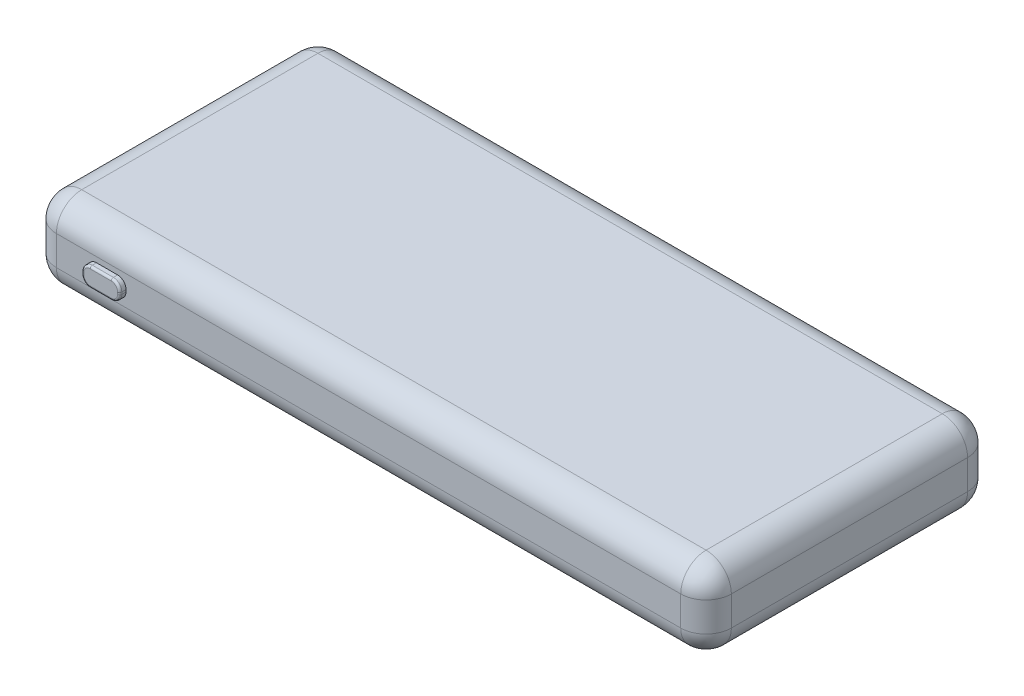
ISO-10303-21;
HEADER;
FILE_DESCRIPTION(('STEP AP214'),'2;1');
FILE_NAME('part.step','',(''),(''),'','','');
FILE_SCHEMA(('AUTOMOTIVE_DESIGN { 1 0 10303 214 1 1 1 1 }'));
ENDSEC;
DATA;
#1=APPLICATION_CONTEXT('core data for automotive mechanical design processes');
#2=APPLICATION_PROTOCOL_DEFINITION('international standard','automotive_design',2000,#1);
#3=PRODUCT_CONTEXT('',#1,'mechanical');
#4=PRODUCT('Part','Part','',(#3));
#5=PRODUCT_RELATED_PRODUCT_CATEGORY('part','',(#4));
#6=PRODUCT_DEFINITION_FORMATION('','',#4);
#7=PRODUCT_DEFINITION_CONTEXT('part definition',#1,'design');
#8=PRODUCT_DEFINITION('design','',#6,#7);
#9=PRODUCT_DEFINITION_SHAPE('','',#8);
#10=(LENGTH_UNIT() NAMED_UNIT(*) SI_UNIT(.MILLI.,.METRE.));
#11=(NAMED_UNIT(*) PLANE_ANGLE_UNIT() SI_UNIT($,.RADIAN.));
#12=(NAMED_UNIT(*) SI_UNIT($,.STERADIAN.) SOLID_ANGLE_UNIT());
#13=UNCERTAINTY_MEASURE_WITH_UNIT(LENGTH_MEASURE(1.E-05),#10,'distance_accuracy_value','');
#14=(GEOMETRIC_REPRESENTATION_CONTEXT(3) GLOBAL_UNCERTAINTY_ASSIGNED_CONTEXT((#13)) GLOBAL_UNIT_ASSIGNED_CONTEXT((#10,
#11,#12)) REPRESENTATION_CONTEXT('',''));
#15=CARTESIAN_POINT('',(0.,0.,0.));
#16=DIRECTION('',(0.,0.,1.));
#17=DIRECTION('',(1.,0.,0.));
#18=AXIS2_PLACEMENT_3D('',#15,#16,#17);
#19=CARTESIAN_POINT('',(-80.,19.,34.));
#20=DIRECTION('',(0.,0.,-1.));
#21=DIRECTION('',(-1.,0.,0.));
#22=AXIS2_PLACEMENT_3D('',#19,#20,#21);
#23=PLANE('',#22);
#24=DIRECTION('',(1.,0.,0.));
#25=VECTOR('',#24,1.);
#26=CARTESIAN_POINT('',(-80.,13.,34.));
#27=LINE('',#26,#25);
#28=CARTESIAN_POINT('',(74.,13.,34.));
#29=VERTEX_POINT('',#28);
#30=CARTESIAN_POINT('',(-74.,13.,34.));
#31=VERTEX_POINT('',#30);
#32=EDGE_CURVE('E208',#29,#31,#27,.F.);
#33=ORIENTED_EDGE('',*,*,#32,.T.);
#34=DIRECTION('',(0.,-1.,0.));
#35=VECTOR('',#34,1.);
#36=CARTESIAN_POINT('',(-74.,19.,34.));
#37=LINE('',#36,#35);
#38=CARTESIAN_POINT('',(-74.,6.,34.));
#39=VERTEX_POINT('',#38);
#40=EDGE_CURVE('E247',#31,#39,#37,.T.);
#41=ORIENTED_EDGE('',*,*,#40,.T.);
#42=DIRECTION('',(1.,0.,0.));
#43=VECTOR('',#42,1.);
#44=CARTESIAN_POINT('',(80.,6.,34.));
#45=LINE('',#44,#43);
#46=CARTESIAN_POINT('',(74.,6.,34.));
#47=VERTEX_POINT('',#46);
#48=EDGE_CURVE('E240',#39,#47,#45,.T.);
#49=ORIENTED_EDGE('',*,*,#48,.T.);
#50=DIRECTION('',(0.,-1.,0.));
#51=VECTOR('',#50,1.);
#52=CARTESIAN_POINT('',(74.,19.,34.));
#53=LINE('',#52,#51);
#54=EDGE_CURVE('E238',#47,#29,#53,.F.);
#55=ORIENTED_EDGE('',*,*,#54,.T.);
#56=EDGE_LOOP('',(#33,#41,#49,#55));
#57=FACE_BOUND('',#56,.T.);
#58=DIRECTION('',(0.,1.,0.));
#59=VECTOR('',#58,1.);
#60=CARTESIAN_POINT('',(-57.5,7.25,34.));
#61=LINE('',#60,#59);
#62=CARTESIAN_POINT('',(-57.5,9.25,34.));
#63=VERTEX_POINT('',#62);
#64=CARTESIAN_POINT('',(-57.5,9.75,34.));
#65=VERTEX_POINT('',#64);
#66=EDGE_CURVE('E422',#63,#65,#61,.T.);
#67=ORIENTED_EDGE('',*,*,#66,.F.);
#68=CARTESIAN_POINT('',(-59.5,9.25,34.));
#69=DIRECTION('',(0.,0.,-1.));
#70=DIRECTION('',(-1.,0.,0.));
#71=AXIS2_PLACEMENT_3D('',#68,#69,#70);
#72=CIRCLE('',#71,2.);
#73=CARTESIAN_POINT('',(-59.5,7.25,34.));
#74=VERTEX_POINT('',#73);
#75=EDGE_CURVE('E387',#63,#74,#72,.T.);
#76=ORIENTED_EDGE('',*,*,#75,.T.);
#77=DIRECTION('',(1.,0.,0.));
#78=VECTOR('',#77,1.);
#79=CARTESIAN_POINT('',(-66.5,7.25,34.));
#80=LINE('',#79,#78);
#81=CARTESIAN_POINT('',(-64.5,7.25,34.));
#82=VERTEX_POINT('',#81);
#83=EDGE_CURVE('E211',#82,#74,#80,.T.);
#84=ORIENTED_EDGE('',*,*,#83,.F.);
#85=CARTESIAN_POINT('',(-64.5,9.25,34.));
#86=DIRECTION('',(0.,0.,-1.));
#87=DIRECTION('',(-1.,0.,0.));
#88=AXIS2_PLACEMENT_3D('',#85,#86,#87);
#89=CIRCLE('',#88,2.);
#90=CARTESIAN_POINT('',(-66.5,9.25,34.));
#91=VERTEX_POINT('',#90);
#92=EDGE_CURVE('E48',#82,#91,#89,.T.);
#93=ORIENTED_EDGE('',*,*,#92,.T.);
#94=DIRECTION('',(0.,-1.,0.));
#95=VECTOR('',#94,1.);
#96=CARTESIAN_POINT('',(-66.5,7.25,34.));
#97=LINE('',#96,#95);
#98=CARTESIAN_POINT('',(-66.5,9.75,34.));
#99=VERTEX_POINT('',#98);
#100=EDGE_CURVE('E429',#99,#91,#97,.T.);
#101=ORIENTED_EDGE('',*,*,#100,.F.);
#102=CARTESIAN_POINT('',(-64.5,9.75,34.));
#103=DIRECTION('',(0.,0.,-1.));
#104=DIRECTION('',(-1.,0.,0.));
#105=AXIS2_PLACEMENT_3D('',#102,#103,#104);
#106=CIRCLE('',#105,2.);
#107=CARTESIAN_POINT('',(-64.5,11.75,34.));
#108=VERTEX_POINT('',#107);
#109=EDGE_CURVE('E12',#99,#108,#106,.T.);
#110=ORIENTED_EDGE('',*,*,#109,.T.);
#111=DIRECTION('',(-1.,0.,0.));
#112=VECTOR('',#111,1.);
#113=CARTESIAN_POINT('',(-66.5,11.75,34.));
#114=LINE('',#113,#112);
#115=CARTESIAN_POINT('',(-59.5,11.75,34.));
#116=VERTEX_POINT('',#115);
#117=EDGE_CURVE('E425',#116,#108,#114,.T.);
#118=ORIENTED_EDGE('',*,*,#117,.F.);
#119=CARTESIAN_POINT('',(-59.5,9.75,34.));
#120=DIRECTION('',(0.,0.,-1.));
#121=DIRECTION('',(-1.,0.,0.));
#122=AXIS2_PLACEMENT_3D('',#119,#120,#121);
#123=CIRCLE('',#122,2.);
#124=EDGE_CURVE('E385',#116,#65,#123,.T.);
#125=ORIENTED_EDGE('',*,*,#124,.T.);
#126=EDGE_LOOP('',(#67,#76,#84,#93,#101,#110,#118,#125));
#127=FACE_BOUND('',#126,.T.);
#128=ADVANCED_FACE('F39',(#57,#127),#23,.F.);
#129=CARTESIAN_POINT('',(80.,19.,34.));
#130=DIRECTION('',(-1.,0.,0.));
#131=DIRECTION('',(0.,0.,1.));
#132=AXIS2_PLACEMENT_3D('',#129,#130,#131);
#133=PLANE('',#132);
#134=DIRECTION('',(0.,0.,-1.));
#135=VECTOR('',#134,1.);
#136=CARTESIAN_POINT('',(80.,6.,-34.));
#137=LINE('',#136,#135);
#138=CARTESIAN_POINT('',(80.,6.,28.));
#139=VERTEX_POINT('',#138);
#140=CARTESIAN_POINT('',(80.,6.,-28.));
#141=VERTEX_POINT('',#140);
#142=EDGE_CURVE('E269',#139,#141,#137,.T.);
#143=ORIENTED_EDGE('',*,*,#142,.T.);
#144=DIRECTION('',(0.,-1.,0.));
#145=VECTOR('',#144,1.);
#146=CARTESIAN_POINT('',(80.,19.,-28.));
#147=LINE('',#146,#145);
#148=CARTESIAN_POINT('',(80.,13.,-28.));
#149=VERTEX_POINT('',#148);
#150=EDGE_CURVE('E274',#141,#149,#147,.F.);
#151=ORIENTED_EDGE('',*,*,#150,.T.);
#152=DIRECTION('',(0.,0.,-1.));
#153=VECTOR('',#152,1.);
#154=CARTESIAN_POINT('',(80.,13.,34.));
#155=LINE('',#154,#153);
#156=CARTESIAN_POINT('',(80.,13.,28.));
#157=VERTEX_POINT('',#156);
#158=EDGE_CURVE('E271',#149,#157,#155,.F.);
#159=ORIENTED_EDGE('',*,*,#158,.T.);
#160=DIRECTION('',(0.,-1.,0.));
#161=VECTOR('',#160,1.);
#162=CARTESIAN_POINT('',(80.,19.,28.));
#163=LINE('',#162,#161);
#164=EDGE_CURVE('E267',#157,#139,#163,.T.);
#165=ORIENTED_EDGE('',*,*,#164,.T.);
#166=EDGE_LOOP('',(#143,#151,#159,#165));
#167=FACE_BOUND('',#166,.T.);
#168=ADVANCED_FACE('F467',(#167),#133,.F.);
#169=CARTESIAN_POINT('',(-80.,19.,-34.));
#170=DIRECTION('',(0.,0.,1.));
#171=DIRECTION('',(1.,0.,0.));
#172=AXIS2_PLACEMENT_3D('',#169,#170,#171);
#173=PLANE('',#172);
#174=DIRECTION('',(-1.,0.,0.));
#175=VECTOR('',#174,1.);
#176=CARTESIAN_POINT('',(-80.,6.,-34.));
#177=LINE('',#176,#175);
#178=CARTESIAN_POINT('',(74.,6.,-34.));
#179=VERTEX_POINT('',#178);
#180=CARTESIAN_POINT('',(-74.,6.,-34.));
#181=VERTEX_POINT('',#180);
#182=EDGE_CURVE('E260',#179,#181,#177,.T.);
#183=ORIENTED_EDGE('',*,*,#182,.T.);
#184=DIRECTION('',(0.,-1.,0.));
#185=VECTOR('',#184,1.);
#186=CARTESIAN_POINT('',(-74.,19.,-34.));
#187=LINE('',#186,#185);
#188=CARTESIAN_POINT('',(-74.,13.,-34.));
#189=VERTEX_POINT('',#188);
#190=EDGE_CURVE('E265',#181,#189,#187,.F.);
#191=ORIENTED_EDGE('',*,*,#190,.T.);
#192=DIRECTION('',(-1.,0.,0.));
#193=VECTOR('',#192,1.);
#194=CARTESIAN_POINT('',(-80.,13.,-34.));
#195=LINE('',#194,#193);
#196=CARTESIAN_POINT('',(74.,13.,-34.));
#197=VERTEX_POINT('',#196);
#198=EDGE_CURVE('E262',#189,#197,#195,.F.);
#199=ORIENTED_EDGE('',*,*,#198,.T.);
#200=DIRECTION('',(0.,-1.,0.));
#201=VECTOR('',#200,1.);
#202=CARTESIAN_POINT('',(74.,19.,-34.));
#203=LINE('',#202,#201);
#204=EDGE_CURVE('E258',#197,#179,#203,.T.);
#205=ORIENTED_EDGE('',*,*,#204,.T.);
#206=EDGE_LOOP('',(#183,#191,#199,#205));
#207=FACE_BOUND('',#206,.T.);
#208=ADVANCED_FACE('F491',(#207),#173,.F.);
#209=CARTESIAN_POINT('',(-80.,19.,34.));
#210=DIRECTION('',(1.,0.,0.));
#211=DIRECTION('',(0.,0.,-1.));
#212=AXIS2_PLACEMENT_3D('',#209,#210,#211);
#213=PLANE('',#212);
#214=DIRECTION('',(0.,0.,1.));
#215=VECTOR('',#214,1.);
#216=CARTESIAN_POINT('',(-80.,6.,34.));
#217=LINE('',#216,#215);
#218=CARTESIAN_POINT('',(-80.,6.,-28.));
#219=VERTEX_POINT('',#218);
#220=CARTESIAN_POINT('',(-80.,6.,28.));
#221=VERTEX_POINT('',#220);
#222=EDGE_CURVE('E251',#219,#221,#217,.T.);
#223=ORIENTED_EDGE('',*,*,#222,.T.);
#224=DIRECTION('',(0.,-1.,0.));
#225=VECTOR('',#224,1.);
#226=CARTESIAN_POINT('',(-80.,19.,28.));
#227=LINE('',#226,#225);
#228=CARTESIAN_POINT('',(-80.,13.,28.));
#229=VERTEX_POINT('',#228);
#230=EDGE_CURVE('E256',#221,#229,#227,.F.);
#231=ORIENTED_EDGE('',*,*,#230,.T.);
#232=DIRECTION('',(0.,0.,1.));
#233=VECTOR('',#232,1.);
#234=CARTESIAN_POINT('',(-80.,13.,34.));
#235=LINE('',#234,#233);
#236=CARTESIAN_POINT('',(-80.,13.,-28.));
#237=VERTEX_POINT('',#236);
#238=EDGE_CURVE('E253',#229,#237,#235,.F.);
#239=ORIENTED_EDGE('',*,*,#238,.T.);
#240=DIRECTION('',(0.,-1.,0.));
#241=VECTOR('',#240,1.);
#242=CARTESIAN_POINT('',(-80.,19.,-28.));
#243=LINE('',#242,#241);
#244=EDGE_CURVE('E249',#237,#219,#243,.T.);
#245=ORIENTED_EDGE('',*,*,#244,.T.);
#246=EDGE_LOOP('',(#223,#231,#239,#245));
#247=FACE_BOUND('',#246,.T.);
#248=ADVANCED_FACE('F497',(#247),#213,.F.);
#249=CARTESIAN_POINT('',(0.,19.,0.));
#250=DIRECTION('',(0.,-1.,0.));
#251=DIRECTION('',(0.,0.,-1.));
#252=AXIS2_PLACEMENT_3D('',#249,#250,#251);
#253=PLANE('',#252);
#254=DIRECTION('',(0.,0.,1.));
#255=VECTOR('',#254,1.);
#256=CARTESIAN_POINT('',(-74.,19.,0.));
#257=LINE('',#256,#255);
#258=CARTESIAN_POINT('',(-74.,19.,-28.));
#259=VERTEX_POINT('',#258);
#260=CARTESIAN_POINT('',(-74.,19.,28.));
#261=VERTEX_POINT('',#260);
#262=EDGE_CURVE('E236',#259,#261,#257,.T.);
#263=ORIENTED_EDGE('',*,*,#262,.T.);
#264=DIRECTION('',(1.,0.,0.));
#265=VECTOR('',#264,1.);
#266=CARTESIAN_POINT('',(0.,19.,28.));
#267=LINE('',#266,#265);
#268=CARTESIAN_POINT('',(74.,19.,28.));
#269=VERTEX_POINT('',#268);
#270=EDGE_CURVE('E206',#261,#269,#267,.T.);
#271=ORIENTED_EDGE('',*,*,#270,.T.);
#272=DIRECTION('',(0.,0.,-1.));
#273=VECTOR('',#272,1.);
#274=CARTESIAN_POINT('',(74.,19.,0.));
#275=LINE('',#274,#273);
#276=CARTESIAN_POINT('',(74.,19.,-28.));
#277=VERTEX_POINT('',#276);
#278=EDGE_CURVE('E225',#269,#277,#275,.T.);
#279=ORIENTED_EDGE('',*,*,#278,.T.);
#280=DIRECTION('',(-1.,0.,0.));
#281=VECTOR('',#280,1.);
#282=CARTESIAN_POINT('',(0.,19.,-28.));
#283=LINE('',#282,#281);
#284=EDGE_CURVE('E231',#277,#259,#283,.T.);
#285=ORIENTED_EDGE('',*,*,#284,.T.);
#286=EDGE_LOOP('',(#263,#271,#279,#285));
#287=FACE_BOUND('',#286,.T.);
#288=ADVANCED_FACE('F234',(#287),#253,.F.);
#289=CARTESIAN_POINT('',(0.,0.,0.));
#290=DIRECTION('',(0.,-1.,0.));
#291=DIRECTION('',(0.,0.,-1.));
#292=AXIS2_PLACEMENT_3D('',#289,#290,#291);
#293=PLANE('',#292);
#294=DIRECTION('',(0.,0.,1.));
#295=VECTOR('',#294,1.);
#296=CARTESIAN_POINT('',(-74.,0.,-34.));
#297=LINE('',#296,#295);
#298=CARTESIAN_POINT('',(-74.,0.,28.));
#299=VERTEX_POINT('',#298);
#300=CARTESIAN_POINT('',(-74.,0.,-28.));
#301=VERTEX_POINT('',#300);
#302=EDGE_CURVE('E280',#299,#301,#297,.F.);
#303=ORIENTED_EDGE('',*,*,#302,.T.);
#304=DIRECTION('',(-1.,0.,0.));
#305=VECTOR('',#304,1.);
#306=CARTESIAN_POINT('',(80.,0.,-28.));
#307=LINE('',#306,#305);
#308=CARTESIAN_POINT('',(74.,0.,-28.));
#309=VERTEX_POINT('',#308);
#310=EDGE_CURVE('E282',#301,#309,#307,.F.);
#311=ORIENTED_EDGE('',*,*,#310,.T.);
#312=DIRECTION('',(0.,0.,-1.));
#313=VECTOR('',#312,1.);
#314=CARTESIAN_POINT('',(74.,0.,34.));
#315=LINE('',#314,#313);
#316=CARTESIAN_POINT('',(74.,0.,28.));
#317=VERTEX_POINT('',#316);
#318=EDGE_CURVE('E276',#309,#317,#315,.F.);
#319=ORIENTED_EDGE('',*,*,#318,.T.);
#320=DIRECTION('',(1.,0.,0.));
#321=VECTOR('',#320,1.);
#322=CARTESIAN_POINT('',(-80.,0.,28.));
#323=LINE('',#322,#321);
#324=EDGE_CURVE('E278',#317,#299,#323,.F.);
#325=ORIENTED_EDGE('',*,*,#324,.T.);
#326=EDGE_LOOP('',(#303,#311,#319,#325));
#327=FACE_BOUND('',#326,.T.);
#328=ADVANCED_FACE('F495',(#327),#293,.T.);
#329=CARTESIAN_POINT('',(-80.,6.,-28.));
#330=DIRECTION('',(1.,0.,0.));
#331=DIRECTION('',(0.,0.,-1.));
#332=AXIS2_PLACEMENT_3D('',#329,#330,#331);
#333=CYLINDRICAL_SURFACE('',#332,6.);
#334=CARTESIAN_POINT('',(-74.,6.,-28.));
#335=DIRECTION('',(-1.,0.,0.));
#336=DIRECTION('',(0.,0.,1.));
#337=AXIS2_PLACEMENT_3D('',#334,#335,#336);
#338=CIRCLE('',#337,6.);
#339=EDGE_CURVE('E232',#181,#301,#338,.T.);
#340=ORIENTED_EDGE('',*,*,#339,.F.);
#341=ORIENTED_EDGE('',*,*,#182,.F.);
#342=CARTESIAN_POINT('',(74.,6.,-28.));
#343=DIRECTION('',(1.,0.,0.));
#344=DIRECTION('',(0.,0.,-1.));
#345=AXIS2_PLACEMENT_3D('',#342,#343,#344);
#346=CIRCLE('',#345,6.);
#347=EDGE_CURVE('E337',#309,#179,#346,.T.);
#348=ORIENTED_EDGE('',*,*,#347,.F.);
#349=ORIENTED_EDGE('',*,*,#310,.F.);
#350=EDGE_LOOP('',(#340,#341,#348,#349));
#351=FACE_BOUND('',#350,.T.);
#352=ADVANCED_FACE('F889',(#351),#333,.T.);
#353=CARTESIAN_POINT('',(-74.,6.,-28.));
#354=DIRECTION('',(0.,-1.,0.));
#355=DIRECTION('',(0.,0.,-1.));
#356=AXIS2_PLACEMENT_3D('',#353,#354,#355);
#357=SPHERICAL_SURFACE('',#356,6.);
#358=CARTESIAN_POINT('',(-74.,6.,-28.));
#359=DIRECTION('',(0.,-1.,0.));
#360=DIRECTION('',(0.,0.,-1.));
#361=AXIS2_PLACEMENT_3D('',#358,#359,#360);
#362=CIRCLE('',#361,6.);
#363=EDGE_CURVE('E331',#181,#219,#362,.F.);
#364=ORIENTED_EDGE('',*,*,#363,.F.);
#365=ORIENTED_EDGE('',*,*,#339,.T.);
#366=CARTESIAN_POINT('',(-74.,6.,-28.));
#367=DIRECTION('',(0.,0.,-1.));
#368=DIRECTION('',(-1.,0.,0.));
#369=AXIS2_PLACEMENT_3D('',#366,#367,#368);
#370=CIRCLE('',#369,6.);
#371=EDGE_CURVE('E334',#219,#301,#370,.F.);
#372=ORIENTED_EDGE('',*,*,#371,.F.);
#373=EDGE_LOOP('',(#364,#365,#372));
#374=FACE_BOUND('',#373,.T.);
#375=ADVANCED_FACE('F878',(#374),#357,.T.);
#376=CARTESIAN_POINT('',(74.,6.,-28.));
#377=DIRECTION('',(0.,0.,-1.));
#378=DIRECTION('',(-1.,0.,0.));
#379=AXIS2_PLACEMENT_3D('',#376,#377,#378);
#380=SPHERICAL_SURFACE('',#379,6.);
#381=CARTESIAN_POINT('',(74.,6.,-28.));
#382=DIRECTION('',(0.,0.,-1.));
#383=DIRECTION('',(-1.,0.,0.));
#384=AXIS2_PLACEMENT_3D('',#381,#382,#383);
#385=CIRCLE('',#384,6.);
#386=EDGE_CURVE('E325',#309,#141,#385,.F.);
#387=ORIENTED_EDGE('',*,*,#386,.F.);
#388=ORIENTED_EDGE('',*,*,#347,.T.);
#389=CARTESIAN_POINT('',(74.,6.,-28.));
#390=DIRECTION('',(0.,-1.,0.));
#391=DIRECTION('',(0.,0.,-1.));
#392=AXIS2_PLACEMENT_3D('',#389,#390,#391);
#393=CIRCLE('',#392,6.);
#394=EDGE_CURVE('E328',#141,#179,#393,.F.);
#395=ORIENTED_EDGE('',*,*,#394,.F.);
#396=EDGE_LOOP('',(#387,#388,#395));
#397=FACE_BOUND('',#396,.T.);
#398=ADVANCED_FACE('F867',(#397),#380,.T.);
#399=CARTESIAN_POINT('',(-74.,6.,34.));
#400=DIRECTION('',(0.,0.,-1.));
#401=DIRECTION('',(-1.,0.,0.));
#402=AXIS2_PLACEMENT_3D('',#399,#400,#401);
#403=CYLINDRICAL_SURFACE('',#402,6.);
#404=ORIENTED_EDGE('',*,*,#371,.T.);
#405=ORIENTED_EDGE('',*,*,#302,.F.);
#406=CARTESIAN_POINT('',(-74.,6.,28.));
#407=DIRECTION('',(0.,0.,1.));
#408=DIRECTION('',(1.,0.,0.));
#409=AXIS2_PLACEMENT_3D('',#406,#407,#408);
#410=CIRCLE('',#409,6.);
#411=EDGE_CURVE('E319',#221,#299,#410,.T.);
#412=ORIENTED_EDGE('',*,*,#411,.F.);
#413=ORIENTED_EDGE('',*,*,#222,.F.);
#414=EDGE_LOOP('',(#404,#405,#412,#413));
#415=FACE_BOUND('',#414,.T.);
#416=ADVANCED_FACE('F856',(#415),#403,.T.);
#417=CARTESIAN_POINT('',(-74.,19.,-28.));
#418=DIRECTION('',(0.,-1.,0.));
#419=DIRECTION('',(0.,0.,-1.));
#420=AXIS2_PLACEMENT_3D('',#417,#418,#419);
#421=CYLINDRICAL_SURFACE('',#420,6.);
#422=ORIENTED_EDGE('',*,*,#363,.T.);
#423=ORIENTED_EDGE('',*,*,#244,.F.);
#424=CARTESIAN_POINT('',(-74.,13.,-28.));
#425=DIRECTION('',(0.,1.,0.));
#426=DIRECTION('',(0.,0.,1.));
#427=AXIS2_PLACEMENT_3D('',#424,#425,#426);
#428=CIRCLE('',#427,6.);
#429=EDGE_CURVE('E316',#189,#237,#428,.T.);
#430=ORIENTED_EDGE('',*,*,#429,.F.);
#431=ORIENTED_EDGE('',*,*,#190,.F.);
#432=EDGE_LOOP('',(#422,#423,#430,#431));
#433=FACE_BOUND('',#432,.T.);
#434=ADVANCED_FACE('F846',(#433),#421,.T.);
#435=CARTESIAN_POINT('',(0.,13.,-28.));
#436=DIRECTION('',(-1.,0.,0.));
#437=DIRECTION('',(0.,0.,1.));
#438=AXIS2_PLACEMENT_3D('',#435,#436,#437);
#439=CYLINDRICAL_SURFACE('',#438,6.);
#440=CARTESIAN_POINT('',(74.,13.,-28.));
#441=DIRECTION('',(1.,0.,0.));
#442=DIRECTION('',(0.,0.,-1.));
#443=AXIS2_PLACEMENT_3D('',#440,#441,#442);
#444=CIRCLE('',#443,6.);
#445=EDGE_CURVE('E310',#197,#277,#444,.T.);
#446=ORIENTED_EDGE('',*,*,#445,.F.);
#447=ORIENTED_EDGE('',*,*,#198,.F.);
#448=CARTESIAN_POINT('',(-74.,13.,-28.));
#449=DIRECTION('',(-1.,0.,0.));
#450=DIRECTION('',(0.,0.,1.));
#451=AXIS2_PLACEMENT_3D('',#448,#449,#450);
#452=CIRCLE('',#451,6.);
#453=EDGE_CURVE('E313',#259,#189,#452,.T.);
#454=ORIENTED_EDGE('',*,*,#453,.F.);
#455=ORIENTED_EDGE('',*,*,#284,.F.);
#456=EDGE_LOOP('',(#446,#447,#454,#455));
#457=FACE_BOUND('',#456,.T.);
#458=ADVANCED_FACE('F440',(#457),#439,.T.);
#459=CARTESIAN_POINT('',(74.,19.,-28.));
#460=DIRECTION('',(0.,-1.,0.));
#461=DIRECTION('',(0.,0.,-1.));
#462=AXIS2_PLACEMENT_3D('',#459,#460,#461);
#463=CYLINDRICAL_SURFACE('',#462,6.);
#464=ORIENTED_EDGE('',*,*,#394,.T.);
#465=ORIENTED_EDGE('',*,*,#204,.F.);
#466=CARTESIAN_POINT('',(74.,13.,-28.));
#467=DIRECTION('',(0.,1.,0.));
#468=DIRECTION('',(0.,0.,1.));
#469=AXIS2_PLACEMENT_3D('',#466,#467,#468);
#470=CIRCLE('',#469,6.);
#471=EDGE_CURVE('E308',#149,#197,#470,.T.);
#472=ORIENTED_EDGE('',*,*,#471,.F.);
#473=ORIENTED_EDGE('',*,*,#150,.F.);
#474=EDGE_LOOP('',(#464,#465,#472,#473));
#475=FACE_BOUND('',#474,.T.);
#476=ADVANCED_FACE('F472',(#475),#463,.T.);
#477=CARTESIAN_POINT('',(74.,6.,34.));
#478=DIRECTION('',(0.,0.,1.));
#479=DIRECTION('',(1.,0.,0.));
#480=AXIS2_PLACEMENT_3D('',#477,#478,#479);
#481=CYLINDRICAL_SURFACE('',#480,6.);
#482=ORIENTED_EDGE('',*,*,#386,.T.);
#483=ORIENTED_EDGE('',*,*,#142,.F.);
#484=CARTESIAN_POINT('',(74.,6.,28.));
#485=DIRECTION('',(0.,0.,1.));
#486=DIRECTION('',(1.,0.,0.));
#487=AXIS2_PLACEMENT_3D('',#484,#485,#486);
#488=CIRCLE('',#487,6.);
#489=EDGE_CURVE('E305',#317,#139,#488,.T.);
#490=ORIENTED_EDGE('',*,*,#489,.F.);
#491=ORIENTED_EDGE('',*,*,#318,.F.);
#492=EDGE_LOOP('',(#482,#483,#490,#491));
#493=FACE_BOUND('',#492,.T.);
#494=ADVANCED_FACE('F816',(#493),#481,.T.);
#495=CARTESIAN_POINT('',(-80.,6.,28.));
#496=DIRECTION('',(-1.,0.,0.));
#497=DIRECTION('',(0.,0.,1.));
#498=AXIS2_PLACEMENT_3D('',#495,#496,#497);
#499=CYLINDRICAL_SURFACE('',#498,6.);
#500=CARTESIAN_POINT('',(-74.,6.,28.));
#501=DIRECTION('',(-1.,0.,0.));
#502=DIRECTION('',(0.,0.,1.));
#503=AXIS2_PLACEMENT_3D('',#500,#501,#502);
#504=CIRCLE('',#503,6.);
#505=EDGE_CURVE('E322',#299,#39,#504,.T.);
#506=ORIENTED_EDGE('',*,*,#505,.F.);
#507=ORIENTED_EDGE('',*,*,#324,.F.);
#508=CARTESIAN_POINT('',(74.,6.,28.));
#509=DIRECTION('',(1.,0.,0.));
#510=DIRECTION('',(0.,0.,-1.));
#511=AXIS2_PLACEMENT_3D('',#508,#509,#510);
#512=CIRCLE('',#511,6.);
#513=EDGE_CURVE('E302',#47,#317,#512,.T.);
#514=ORIENTED_EDGE('',*,*,#513,.F.);
#515=ORIENTED_EDGE('',*,*,#48,.F.);
#516=EDGE_LOOP('',(#506,#507,#514,#515));
#517=FACE_BOUND('',#516,.T.);
#518=ADVANCED_FACE('F805',(#517),#499,.T.);
#519=CARTESIAN_POINT('',(-74.,6.,28.));
#520=DIRECTION('',(0.,-1.,0.));
#521=DIRECTION('',(0.,0.,-1.));
#522=AXIS2_PLACEMENT_3D('',#519,#520,#521);
#523=SPHERICAL_SURFACE('',#522,6.);
#524=ORIENTED_EDGE('',*,*,#411,.T.);
#525=ORIENTED_EDGE('',*,*,#505,.T.);
#526=CARTESIAN_POINT('',(-74.,6.,28.));
#527=DIRECTION('',(0.,-1.,0.));
#528=DIRECTION('',(0.,0.,-1.));
#529=AXIS2_PLACEMENT_3D('',#526,#527,#528);
#530=CIRCLE('',#529,6.);
#531=EDGE_CURVE('E299',#221,#39,#530,.F.);
#532=ORIENTED_EDGE('',*,*,#531,.F.);
#533=EDGE_LOOP('',(#524,#525,#532));
#534=FACE_BOUND('',#533,.T.);
#535=ADVANCED_FACE('F484',(#534),#523,.T.);
#536=CARTESIAN_POINT('',(-74.,13.,-28.));
#537=DIRECTION('',(0.,0.,-1.));
#538=DIRECTION('',(-1.,0.,0.));
#539=AXIS2_PLACEMENT_3D('',#536,#537,#538);
#540=SPHERICAL_SURFACE('',#539,6.);
#541=ORIENTED_EDGE('',*,*,#453,.T.);
#542=ORIENTED_EDGE('',*,*,#429,.T.);
#543=CARTESIAN_POINT('',(-74.,13.,-28.));
#544=DIRECTION('',(0.,0.,-1.));
#545=DIRECTION('',(-1.,0.,0.));
#546=AXIS2_PLACEMENT_3D('',#543,#544,#545);
#547=CIRCLE('',#546,6.);
#548=EDGE_CURVE('E297',#259,#237,#547,.F.);
#549=ORIENTED_EDGE('',*,*,#548,.F.);
#550=EDGE_LOOP('',(#541,#542,#549));
#551=FACE_BOUND('',#550,.T.);
#552=ADVANCED_FACE('F443',(#551),#540,.T.);
#553=CARTESIAN_POINT('',(74.,13.,-28.));
#554=DIRECTION('',(0.,0.,-1.));
#555=DIRECTION('',(-1.,0.,0.));
#556=AXIS2_PLACEMENT_3D('',#553,#554,#555);
#557=SPHERICAL_SURFACE('',#556,6.);
#558=ORIENTED_EDGE('',*,*,#471,.T.);
#559=ORIENTED_EDGE('',*,*,#445,.T.);
#560=CARTESIAN_POINT('',(74.,13.,-28.));
#561=DIRECTION('',(0.,0.,-1.));
#562=DIRECTION('',(-1.,0.,0.));
#563=AXIS2_PLACEMENT_3D('',#560,#561,#562);
#564=CIRCLE('',#563,6.);
#565=EDGE_CURVE('E228',#149,#277,#564,.F.);
#566=ORIENTED_EDGE('',*,*,#565,.F.);
#567=EDGE_LOOP('',(#558,#559,#566));
#568=FACE_BOUND('',#567,.T.);
#569=ADVANCED_FACE('F474',(#568),#557,.T.);
#570=CARTESIAN_POINT('',(74.,6.,28.));
#571=DIRECTION('',(0.,-1.,0.));
#572=DIRECTION('',(0.,0.,-1.));
#573=AXIS2_PLACEMENT_3D('',#570,#571,#572);
#574=SPHERICAL_SURFACE('',#573,6.);
#575=ORIENTED_EDGE('',*,*,#513,.T.);
#576=ORIENTED_EDGE('',*,*,#489,.T.);
#577=CARTESIAN_POINT('',(74.,6.,28.));
#578=DIRECTION('',(0.,-1.,0.));
#579=DIRECTION('',(0.,0.,-1.));
#580=AXIS2_PLACEMENT_3D('',#577,#578,#579);
#581=CIRCLE('',#580,6.);
#582=EDGE_CURVE('E293',#47,#139,#581,.F.);
#583=ORIENTED_EDGE('',*,*,#582,.F.);
#584=EDGE_LOOP('',(#575,#576,#583));
#585=FACE_BOUND('',#584,.T.);
#586=ADVANCED_FACE('F476',(#585),#574,.T.);
#587=CARTESIAN_POINT('',(-74.,19.,28.));
#588=DIRECTION('',(0.,-1.,0.));
#589=DIRECTION('',(0.,0.,-1.));
#590=AXIS2_PLACEMENT_3D('',#587,#588,#589);
#591=CYLINDRICAL_SURFACE('',#590,6.);
#592=ORIENTED_EDGE('',*,*,#531,.T.);
#593=ORIENTED_EDGE('',*,*,#40,.F.);
#594=CARTESIAN_POINT('',(-74.,13.,28.));
#595=DIRECTION('',(0.,1.,0.));
#596=DIRECTION('',(0.,0.,1.));
#597=AXIS2_PLACEMENT_3D('',#594,#595,#596);
#598=CIRCLE('',#597,6.);
#599=EDGE_CURVE('E290',#229,#31,#598,.T.);
#600=ORIENTED_EDGE('',*,*,#599,.F.);
#601=ORIENTED_EDGE('',*,*,#230,.F.);
#602=EDGE_LOOP('',(#592,#593,#600,#601));
#603=FACE_BOUND('',#602,.T.);
#604=ADVANCED_FACE('F455',(#603),#591,.T.);
#605=CARTESIAN_POINT('',(-74.,13.,0.));
#606=DIRECTION('',(0.,0.,1.));
#607=DIRECTION('',(1.,0.,0.));
#608=AXIS2_PLACEMENT_3D('',#605,#606,#607);
#609=CYLINDRICAL_SURFACE('',#608,6.);
#610=ORIENTED_EDGE('',*,*,#548,.T.);
#611=ORIENTED_EDGE('',*,*,#238,.F.);
#612=CARTESIAN_POINT('',(-74.,13.,28.));
#613=DIRECTION('',(0.,0.,1.));
#614=DIRECTION('',(1.,0.,0.));
#615=AXIS2_PLACEMENT_3D('',#612,#613,#614);
#616=CIRCLE('',#615,6.);
#617=EDGE_CURVE('E222',#261,#229,#616,.T.);
#618=ORIENTED_EDGE('',*,*,#617,.F.);
#619=ORIENTED_EDGE('',*,*,#262,.F.);
#620=EDGE_LOOP('',(#610,#611,#618,#619));
#621=FACE_BOUND('',#620,.T.);
#622=ADVANCED_FACE('F447',(#621),#609,.T.);
#623=CARTESIAN_POINT('',(74.,13.,0.));
#624=DIRECTION('',(0.,0.,-1.));
#625=DIRECTION('',(-1.,0.,0.));
#626=AXIS2_PLACEMENT_3D('',#623,#624,#625);
#627=CYLINDRICAL_SURFACE('',#626,6.);
#628=ORIENTED_EDGE('',*,*,#565,.T.);
#629=ORIENTED_EDGE('',*,*,#278,.F.);
#630=CARTESIAN_POINT('',(74.,13.,28.));
#631=DIRECTION('',(0.,0.,1.));
#632=DIRECTION('',(1.,0.,0.));
#633=AXIS2_PLACEMENT_3D('',#630,#631,#632);
#634=CIRCLE('',#633,6.);
#635=EDGE_CURVE('E214',#157,#269,#634,.T.);
#636=ORIENTED_EDGE('',*,*,#635,.F.);
#637=ORIENTED_EDGE('',*,*,#158,.F.);
#638=EDGE_LOOP('',(#628,#629,#636,#637));
#639=FACE_BOUND('',#638,.T.);
#640=ADVANCED_FACE('F226',(#639),#627,.T.);
#641=CARTESIAN_POINT('',(74.,19.,28.));
#642=DIRECTION('',(0.,-1.,0.));
#643=DIRECTION('',(0.,0.,-1.));
#644=AXIS2_PLACEMENT_3D('',#641,#642,#643);
#645=CYLINDRICAL_SURFACE('',#644,6.);
#646=ORIENTED_EDGE('',*,*,#582,.T.);
#647=ORIENTED_EDGE('',*,*,#164,.F.);
#648=CARTESIAN_POINT('',(74.,13.,28.));
#649=DIRECTION('',(0.,1.,0.));
#650=DIRECTION('',(0.,0.,1.));
#651=AXIS2_PLACEMENT_3D('',#648,#649,#650);
#652=CIRCLE('',#651,6.);
#653=EDGE_CURVE('E218',#29,#157,#652,.T.);
#654=ORIENTED_EDGE('',*,*,#653,.F.);
#655=ORIENTED_EDGE('',*,*,#54,.F.);
#656=EDGE_LOOP('',(#646,#647,#654,#655));
#657=FACE_BOUND('',#656,.T.);
#658=ADVANCED_FACE('F463',(#657),#645,.T.);
#659=CARTESIAN_POINT('',(-74.,13.,28.));
#660=DIRECTION('',(-1.,0.,0.));
#661=DIRECTION('',(0.,0.,1.));
#662=AXIS2_PLACEMENT_3D('',#659,#660,#661);
#663=SPHERICAL_SURFACE('',#662,6.);
#664=ORIENTED_EDGE('',*,*,#617,.T.);
#665=ORIENTED_EDGE('',*,*,#599,.T.);
#666=CARTESIAN_POINT('',(-74.,13.,28.));
#667=DIRECTION('',(-1.,0.,0.));
#668=DIRECTION('',(0.,0.,1.));
#669=AXIS2_PLACEMENT_3D('',#666,#667,#668);
#670=CIRCLE('',#669,6.);
#671=EDGE_CURVE('E210',#261,#31,#670,.F.);
#672=ORIENTED_EDGE('',*,*,#671,.F.);
#673=EDGE_LOOP('',(#664,#665,#672));
#674=FACE_BOUND('',#673,.T.);
#675=ADVANCED_FACE('F451',(#674),#663,.T.);
#676=CARTESIAN_POINT('',(74.,13.,28.));
#677=DIRECTION('',(1.,0.,0.));
#678=DIRECTION('',(0.,0.,-1.));
#679=AXIS2_PLACEMENT_3D('',#676,#677,#678);
#680=SPHERICAL_SURFACE('',#679,6.);
#681=ORIENTED_EDGE('',*,*,#653,.T.);
#682=ORIENTED_EDGE('',*,*,#635,.T.);
#683=CARTESIAN_POINT('',(74.,13.,28.));
#684=DIRECTION('',(1.,0.,0.));
#685=DIRECTION('',(0.,0.,-1.));
#686=AXIS2_PLACEMENT_3D('',#683,#684,#685);
#687=CIRCLE('',#686,6.);
#688=EDGE_CURVE('E202',#29,#269,#687,.F.);
#689=ORIENTED_EDGE('',*,*,#688,.F.);
#690=EDGE_LOOP('',(#681,#682,#689));
#691=FACE_BOUND('',#690,.T.);
#692=ADVANCED_FACE('F216',(#691),#680,.T.);
#693=CARTESIAN_POINT('',(0.,13.,28.));
#694=DIRECTION('',(1.,0.,0.));
#695=DIRECTION('',(0.,0.,-1.));
#696=AXIS2_PLACEMENT_3D('',#693,#694,#695);
#697=CYLINDRICAL_SURFACE('',#696,6.);
#698=ORIENTED_EDGE('',*,*,#671,.T.);
#699=ORIENTED_EDGE('',*,*,#32,.F.);
#700=ORIENTED_EDGE('',*,*,#688,.T.);
#701=ORIENTED_EDGE('',*,*,#270,.F.);
#702=EDGE_LOOP('',(#698,#699,#700,#701));
#703=FACE_BOUND('',#702,.T.);
#704=ADVANCED_FACE('F204',(#703),#697,.T.);
#705=CARTESIAN_POINT('',(-57.5,7.25,35.5));
#706=DIRECTION('',(-1.,0.,0.));
#707=DIRECTION('',(0.,0.,1.));
#708=AXIS2_PLACEMENT_3D('',#705,#706,#707);
#709=PLANE('',#708);
#710=ORIENTED_EDGE('',*,*,#66,.T.);
#711=DIRECTION('',(0.,0.,-1.));
#712=VECTOR('',#711,1.);
#713=CARTESIAN_POINT('',(-57.5,9.75,35.5));
#714=LINE('',#713,#712);
#715=CARTESIAN_POINT('',(-57.5,9.75,35.));
#716=VERTEX_POINT('',#715);
#717=EDGE_CURVE('E56',#65,#716,#714,.F.);
#718=ORIENTED_EDGE('',*,*,#717,.T.);
#719=DIRECTION('',(0.,1.,0.));
#720=VECTOR('',#719,1.);
#721=CARTESIAN_POINT('',(-57.5,7.25,35.));
#722=LINE('',#721,#720);
#723=CARTESIAN_POINT('',(-57.5,9.25,35.));
#724=VERTEX_POINT('',#723);
#725=EDGE_CURVE('E61',#716,#724,#722,.F.);
#726=ORIENTED_EDGE('',*,*,#725,.T.);
#727=DIRECTION('',(0.,0.,-1.));
#728=VECTOR('',#727,1.);
#729=CARTESIAN_POINT('',(-57.5,9.25,35.5));
#730=LINE('',#729,#728);
#731=EDGE_CURVE('E381',#724,#63,#730,.T.);
#732=ORIENTED_EDGE('',*,*,#731,.T.);
#733=EDGE_LOOP('',(#710,#718,#726,#732));
#734=FACE_BOUND('',#733,.T.);
#735=ADVANCED_FACE('F506',(#734),#709,.F.);
#736=CARTESIAN_POINT('',(-66.5,11.75,35.5));
#737=DIRECTION('',(0.,-1.,0.));
#738=DIRECTION('',(0.,0.,-1.));
#739=AXIS2_PLACEMENT_3D('',#736,#737,#738);
#740=PLANE('',#739);
#741=DIRECTION('',(-1.,0.,0.));
#742=VECTOR('',#741,1.);
#743=CARTESIAN_POINT('',(-66.5,11.75,35.));
#744=LINE('',#743,#742);
#745=CARTESIAN_POINT('',(-64.5,11.75,35.));
#746=VERTEX_POINT('',#745);
#747=CARTESIAN_POINT('',(-59.5,11.75,35.));
#748=VERTEX_POINT('',#747);
#749=EDGE_CURVE('E377',#746,#748,#744,.F.);
#750=ORIENTED_EDGE('',*,*,#749,.T.);
#751=DIRECTION('',(0.,0.,-1.));
#752=VECTOR('',#751,1.);
#753=CARTESIAN_POINT('',(-59.5,11.75,35.5));
#754=LINE('',#753,#752);
#755=EDGE_CURVE('E379',#748,#116,#754,.T.);
#756=ORIENTED_EDGE('',*,*,#755,.T.);
#757=ORIENTED_EDGE('',*,*,#117,.T.);
#758=DIRECTION('',(0.,0.,-1.));
#759=VECTOR('',#758,1.);
#760=CARTESIAN_POINT('',(-64.5,11.75,35.5));
#761=LINE('',#760,#759);
#762=EDGE_CURVE('E375',#108,#746,#761,.F.);
#763=ORIENTED_EDGE('',*,*,#762,.T.);
#764=EDGE_LOOP('',(#750,#756,#757,#763));
#765=FACE_BOUND('',#764,.T.);
#766=ADVANCED_FACE('F552',(#765),#740,.F.);
#767=CARTESIAN_POINT('',(-66.5,7.25,35.5));
#768=DIRECTION('',(1.,0.,0.));
#769=DIRECTION('',(0.,0.,-1.));
#770=AXIS2_PLACEMENT_3D('',#767,#768,#769);
#771=PLANE('',#770);
#772=ORIENTED_EDGE('',*,*,#100,.T.);
#773=DIRECTION('',(0.,0.,-1.));
#774=VECTOR('',#773,1.);
#775=CARTESIAN_POINT('',(-66.5,9.25,35.5));
#776=LINE('',#775,#774);
#777=CARTESIAN_POINT('',(-66.5,9.25,35.));
#778=VERTEX_POINT('',#777);
#779=EDGE_CURVE('E373',#91,#778,#776,.F.);
#780=ORIENTED_EDGE('',*,*,#779,.T.);
#781=DIRECTION('',(0.,-1.,0.));
#782=VECTOR('',#781,1.);
#783=CARTESIAN_POINT('',(-66.5,7.25,35.));
#784=LINE('',#783,#782);
#785=CARTESIAN_POINT('',(-66.5,9.75,35.));
#786=VERTEX_POINT('',#785);
#787=EDGE_CURVE('E371',#778,#786,#784,.F.);
#788=ORIENTED_EDGE('',*,*,#787,.T.);
#789=DIRECTION('',(0.,0.,-1.));
#790=VECTOR('',#789,1.);
#791=CARTESIAN_POINT('',(-66.5,9.75,35.5));
#792=LINE('',#791,#790);
#793=EDGE_CURVE('E369',#786,#99,#792,.T.);
#794=ORIENTED_EDGE('',*,*,#793,.T.);
#795=EDGE_LOOP('',(#772,#780,#788,#794));
#796=FACE_BOUND('',#795,.T.);
#797=ADVANCED_FACE('F559',(#796),#771,.F.);
#798=CARTESIAN_POINT('',(-66.5,7.25,35.5));
#799=DIRECTION('',(0.,1.,0.));
#800=DIRECTION('',(0.,0.,1.));
#801=AXIS2_PLACEMENT_3D('',#798,#799,#800);
#802=PLANE('',#801);
#803=ORIENTED_EDGE('',*,*,#83,.T.);
#804=DIRECTION('',(0.,0.,-1.));
#805=VECTOR('',#804,1.);
#806=CARTESIAN_POINT('',(-59.5,7.25,35.5));
#807=LINE('',#806,#805);
#808=CARTESIAN_POINT('',(-59.5,7.25,35.));
#809=VERTEX_POINT('',#808);
#810=EDGE_CURVE('E367',#74,#809,#807,.F.);
#811=ORIENTED_EDGE('',*,*,#810,.T.);
#812=DIRECTION('',(1.,0.,0.));
#813=VECTOR('',#812,1.);
#814=CARTESIAN_POINT('',(-66.5,7.25,35.));
#815=LINE('',#814,#813);
#816=CARTESIAN_POINT('',(-64.5,7.25,35.));
#817=VERTEX_POINT('',#816);
#818=EDGE_CURVE('E364',#809,#817,#815,.F.);
#819=ORIENTED_EDGE('',*,*,#818,.T.);
#820=DIRECTION('',(0.,0.,-1.));
#821=VECTOR('',#820,1.);
#822=CARTESIAN_POINT('',(-64.5,7.25,35.5));
#823=LINE('',#822,#821);
#824=EDGE_CURVE('E362',#817,#82,#823,.T.);
#825=ORIENTED_EDGE('',*,*,#824,.T.);
#826=EDGE_LOOP('',(#803,#811,#819,#825));
#827=FACE_BOUND('',#826,.T.);
#828=ADVANCED_FACE('F567',(#827),#802,.F.);
#829=CARTESIAN_POINT('',(0.,0.,35.5));
#830=DIRECTION('',(0.,0.,-1.));
#831=DIRECTION('',(-1.,0.,0.));
#832=AXIS2_PLACEMENT_3D('',#829,#830,#831);
#833=PLANE('',#832);
#834=CARTESIAN_POINT('',(-64.5,9.75,35.5));
#835=DIRECTION('',(0.,0.,-1.));
#836=DIRECTION('',(-1.,0.,0.));
#837=AXIS2_PLACEMENT_3D('',#834,#835,#836);
#838=CIRCLE('',#837,1.5);
#839=CARTESIAN_POINT('',(-66.,9.75,35.5));
#840=VERTEX_POINT('',#839);
#841=CARTESIAN_POINT('',(-64.5,11.25,35.5));
#842=VERTEX_POINT('',#841);
#843=EDGE_CURVE('E354',#840,#842,#838,.T.);
#844=ORIENTED_EDGE('',*,*,#843,.F.);
#845=DIRECTION('',(0.,-1.,0.));
#846=VECTOR('',#845,1.);
#847=CARTESIAN_POINT('',(-66.,0.,35.5));
#848=LINE('',#847,#846);
#849=CARTESIAN_POINT('',(-66.,9.25,35.5));
#850=VERTEX_POINT('',#849);
#851=EDGE_CURVE('E360',#840,#850,#848,.T.);
#852=ORIENTED_EDGE('',*,*,#851,.T.);
#853=CARTESIAN_POINT('',(-64.5,9.25,35.5));
#854=DIRECTION('',(0.,0.,-1.));
#855=DIRECTION('',(-1.,0.,0.));
#856=AXIS2_PLACEMENT_3D('',#853,#854,#855);
#857=CIRCLE('',#856,1.5);
#858=CARTESIAN_POINT('',(-64.5,7.75,35.5));
#859=VERTEX_POINT('',#858);
#860=EDGE_CURVE('E357',#859,#850,#857,.T.);
#861=ORIENTED_EDGE('',*,*,#860,.F.);
#862=DIRECTION('',(1.,0.,0.));
#863=VECTOR('',#862,1.);
#864=CARTESIAN_POINT('',(0.,7.75,35.5));
#865=LINE('',#864,#863);
#866=CARTESIAN_POINT('',(-59.5,7.75,35.5));
#867=VERTEX_POINT('',#866);
#868=EDGE_CURVE('E351',#859,#867,#865,.T.);
#869=ORIENTED_EDGE('',*,*,#868,.T.);
#870=CARTESIAN_POINT('',(-59.5,9.25,35.5));
#871=DIRECTION('',(0.,0.,-1.));
#872=DIRECTION('',(-1.,0.,0.));
#873=AXIS2_PLACEMENT_3D('',#870,#871,#872);
#874=CIRCLE('',#873,1.5);
#875=CARTESIAN_POINT('',(-58.,9.25,35.5));
#876=VERTEX_POINT('',#875);
#877=EDGE_CURVE('E348',#876,#867,#874,.T.);
#878=ORIENTED_EDGE('',*,*,#877,.F.);
#879=DIRECTION('',(0.,1.,0.));
#880=VECTOR('',#879,1.);
#881=CARTESIAN_POINT('',(-58.,0.,35.5));
#882=LINE('',#881,#880);
#883=CARTESIAN_POINT('',(-58.,9.75,35.5));
#884=VERTEX_POINT('',#883);
#885=EDGE_CURVE('E344',#876,#884,#882,.T.);
#886=ORIENTED_EDGE('',*,*,#885,.T.);
#887=CARTESIAN_POINT('',(-59.5,9.75,35.5));
#888=DIRECTION('',(0.,0.,-1.));
#889=DIRECTION('',(-1.,0.,0.));
#890=AXIS2_PLACEMENT_3D('',#887,#888,#889);
#891=CIRCLE('',#890,1.5);
#892=CARTESIAN_POINT('',(-59.5,11.25,35.5));
#893=VERTEX_POINT('',#892);
#894=EDGE_CURVE('E284',#893,#884,#891,.T.);
#895=ORIENTED_EDGE('',*,*,#894,.F.);
#896=DIRECTION('',(-1.,0.,0.));
#897=VECTOR('',#896,1.);
#898=CARTESIAN_POINT('',(0.,11.25,35.5));
#899=LINE('',#898,#897);
#900=EDGE_CURVE('E346',#893,#842,#899,.T.);
#901=ORIENTED_EDGE('',*,*,#900,.T.);
#902=EDGE_LOOP('',(#844,#852,#861,#869,#878,#886,#895,#901));
#903=FACE_BOUND('',#902,.T.);
#904=ADVANCED_FACE('F575',(#903),#833,.F.);
#905=CARTESIAN_POINT('',(-64.5,9.75,35.5));
#906=DIRECTION('',(0.,0.,-1.));
#907=DIRECTION('',(-1.,0.,0.));
#908=AXIS2_PLACEMENT_3D('',#905,#906,#907);
#909=CYLINDRICAL_SURFACE('',#908,2.);
#910=ORIENTED_EDGE('',*,*,#109,.F.);
#911=ORIENTED_EDGE('',*,*,#793,.F.);
#912=CARTESIAN_POINT('',(-64.5,9.75,35.));
#913=DIRECTION('',(0.,0.,-1.));
#914=DIRECTION('',(-1.,0.,0.));
#915=AXIS2_PLACEMENT_3D('',#912,#913,#914);
#916=CIRCLE('',#915,2.);
#917=EDGE_CURVE('E43',#746,#786,#916,.F.);
#918=ORIENTED_EDGE('',*,*,#917,.F.);
#919=ORIENTED_EDGE('',*,*,#762,.F.);
#920=EDGE_LOOP('',(#910,#911,#918,#919));
#921=FACE_BOUND('',#920,.T.);
#922=ADVANCED_FACE('F41',(#921),#909,.T.);
#923=CARTESIAN_POINT('',(0.,11.25,35.));
#924=DIRECTION('',(-1.,0.,0.));
#925=DIRECTION('',(0.,0.,1.));
#926=AXIS2_PLACEMENT_3D('',#923,#924,#925);
#927=CYLINDRICAL_SURFACE('',#926,0.5);
#928=CARTESIAN_POINT('',(-59.5,11.25,35.));
#929=DIRECTION('',(1.,0.,0.));
#930=DIRECTION('',(0.,0.,-1.));
#931=AXIS2_PLACEMENT_3D('',#928,#929,#930);
#932=CIRCLE('',#931,0.5);
#933=EDGE_CURVE('E415',#748,#893,#932,.T.);
#934=ORIENTED_EDGE('',*,*,#933,.F.);
#935=ORIENTED_EDGE('',*,*,#749,.F.);
#936=CARTESIAN_POINT('',(-64.5,11.25,35.));
#937=DIRECTION('',(-1.,0.,0.));
#938=DIRECTION('',(0.,0.,1.));
#939=AXIS2_PLACEMENT_3D('',#936,#937,#938);
#940=CIRCLE('',#939,0.5);
#941=EDGE_CURVE('E417',#842,#746,#940,.T.);
#942=ORIENTED_EDGE('',*,*,#941,.F.);
#943=ORIENTED_EDGE('',*,*,#900,.F.);
#944=EDGE_LOOP('',(#934,#935,#942,#943));
#945=FACE_BOUND('',#944,.T.);
#946=ADVANCED_FACE('F590',(#945),#927,.T.);
#947=CARTESIAN_POINT('',(-59.5,9.75,35.5));
#948=DIRECTION('',(0.,0.,-1.));
#949=DIRECTION('',(-1.,0.,0.));
#950=AXIS2_PLACEMENT_3D('',#947,#948,#949);
#951=CYLINDRICAL_SURFACE('',#950,2.);
#952=ORIENTED_EDGE('',*,*,#124,.F.);
#953=ORIENTED_EDGE('',*,*,#755,.F.);
#954=CARTESIAN_POINT('',(-59.5,9.75,35.));
#955=DIRECTION('',(0.,0.,-1.));
#956=DIRECTION('',(-1.,0.,0.));
#957=AXIS2_PLACEMENT_3D('',#954,#955,#956);
#958=CIRCLE('',#957,2.);
#959=EDGE_CURVE('E412',#716,#748,#958,.F.);
#960=ORIENTED_EDGE('',*,*,#959,.F.);
#961=ORIENTED_EDGE('',*,*,#717,.F.);
#962=EDGE_LOOP('',(#952,#953,#960,#961));
#963=FACE_BOUND('',#962,.T.);
#964=ADVANCED_FACE('F597',(#963),#951,.T.);
#965=CARTESIAN_POINT('',(-64.5,9.75,35.));
#966=DIRECTION('',(0.,0.,-1.));
#967=DIRECTION('',(-1.,0.,0.));
#968=AXIS2_PLACEMENT_3D('',#965,#966,#967);
#969=TOROIDAL_SURFACE('',#968,1.5,0.5);
#970=ORIENTED_EDGE('',*,*,#941,.T.);
#971=ORIENTED_EDGE('',*,*,#917,.T.);
#972=CARTESIAN_POINT('',(-66.,9.75,35.));
#973=DIRECTION('',(0.,1.,0.));
#974=DIRECTION('',(0.,0.,1.));
#975=AXIS2_PLACEMENT_3D('',#972,#973,#974);
#976=CIRCLE('',#975,0.5);
#977=EDGE_CURVE('E409',#840,#786,#976,.F.);
#978=ORIENTED_EDGE('',*,*,#977,.F.);
#979=ORIENTED_EDGE('',*,*,#843,.T.);
#980=EDGE_LOOP('',(#970,#971,#978,#979));
#981=FACE_BOUND('',#980,.T.);
#982=ADVANCED_FACE('F604',(#981),#969,.T.);
#983=CARTESIAN_POINT('',(-59.5,9.75,35.));
#984=DIRECTION('',(0.,0.,-1.));
#985=DIRECTION('',(-1.,0.,0.));
#986=AXIS2_PLACEMENT_3D('',#983,#984,#985);
#987=TOROIDAL_SURFACE('',#986,1.5,0.5);
#988=ORIENTED_EDGE('',*,*,#933,.T.);
#989=ORIENTED_EDGE('',*,*,#894,.T.);
#990=CARTESIAN_POINT('',(-58.,9.75,35.));
#991=DIRECTION('',(0.,1.,0.));
#992=DIRECTION('',(0.,0.,1.));
#993=AXIS2_PLACEMENT_3D('',#990,#991,#992);
#994=CIRCLE('',#993,0.5);
#995=EDGE_CURVE('E406',#716,#884,#994,.F.);
#996=ORIENTED_EDGE('',*,*,#995,.F.);
#997=ORIENTED_EDGE('',*,*,#959,.T.);
#998=EDGE_LOOP('',(#988,#989,#996,#997));
#999=FACE_BOUND('',#998,.T.);
#1000=ADVANCED_FACE('F612',(#999),#987,.T.);
#1001=CARTESIAN_POINT('',(-64.5,9.25,35.5));
#1002=DIRECTION('',(0.,0.,-1.));
#1003=DIRECTION('',(-1.,0.,0.));
#1004=AXIS2_PLACEMENT_3D('',#1001,#1002,#1003);
#1005=CYLINDRICAL_SURFACE('',#1004,2.);
#1006=ORIENTED_EDGE('',*,*,#92,.F.);
#1007=ORIENTED_EDGE('',*,*,#824,.F.);
#1008=CARTESIAN_POINT('',(-64.5,9.25,35.));
#1009=DIRECTION('',(0.,0.,-1.));
#1010=DIRECTION('',(-1.,0.,0.));
#1011=AXIS2_PLACEMENT_3D('',#1008,#1009,#1010);
#1012=CIRCLE('',#1011,2.);
#1013=EDGE_CURVE('E403',#778,#817,#1012,.F.);
#1014=ORIENTED_EDGE('',*,*,#1013,.F.);
#1015=ORIENTED_EDGE('',*,*,#779,.F.);
#1016=EDGE_LOOP('',(#1006,#1007,#1014,#1015));
#1017=FACE_BOUND('',#1016,.T.);
#1018=ADVANCED_FACE('F619',(#1017),#1005,.T.);
#1019=CARTESIAN_POINT('',(-66.,0.,35.));
#1020=DIRECTION('',(0.,-1.,0.));
#1021=DIRECTION('',(0.,0.,-1.));
#1022=AXIS2_PLACEMENT_3D('',#1019,#1020,#1021);
#1023=CYLINDRICAL_SURFACE('',#1022,0.5);
#1024=ORIENTED_EDGE('',*,*,#977,.T.);
#1025=ORIENTED_EDGE('',*,*,#787,.F.);
#1026=CARTESIAN_POINT('',(-66.,9.25,35.));
#1027=DIRECTION('',(0.,-1.,0.));
#1028=DIRECTION('',(0.,0.,-1.));
#1029=AXIS2_PLACEMENT_3D('',#1026,#1027,#1028);
#1030=CIRCLE('',#1029,0.5);
#1031=EDGE_CURVE('E400',#850,#778,#1030,.T.);
#1032=ORIENTED_EDGE('',*,*,#1031,.F.);
#1033=ORIENTED_EDGE('',*,*,#851,.F.);
#1034=EDGE_LOOP('',(#1024,#1025,#1032,#1033));
#1035=FACE_BOUND('',#1034,.T.);
#1036=ADVANCED_FACE('F627',(#1035),#1023,.T.);
#1037=CARTESIAN_POINT('',(-58.,0.,35.));
#1038=DIRECTION('',(0.,1.,0.));
#1039=DIRECTION('',(0.,0.,1.));
#1040=AXIS2_PLACEMENT_3D('',#1037,#1038,#1039);
#1041=CYLINDRICAL_SURFACE('',#1040,0.5);
#1042=ORIENTED_EDGE('',*,*,#995,.T.);
#1043=ORIENTED_EDGE('',*,*,#885,.F.);
#1044=CARTESIAN_POINT('',(-58.,9.25,35.));
#1045=DIRECTION('',(0.,-1.,0.));
#1046=DIRECTION('',(0.,0.,-1.));
#1047=AXIS2_PLACEMENT_3D('',#1044,#1045,#1046);
#1048=CIRCLE('',#1047,0.5);
#1049=EDGE_CURVE('E397',#724,#876,#1048,.T.);
#1050=ORIENTED_EDGE('',*,*,#1049,.F.);
#1051=ORIENTED_EDGE('',*,*,#725,.F.);
#1052=EDGE_LOOP('',(#1042,#1043,#1050,#1051));
#1053=FACE_BOUND('',#1052,.T.);
#1054=ADVANCED_FACE('F635',(#1053),#1041,.T.);
#1055=CARTESIAN_POINT('',(-59.5,9.25,35.5));
#1056=DIRECTION('',(0.,0.,-1.));
#1057=DIRECTION('',(-1.,0.,0.));
#1058=AXIS2_PLACEMENT_3D('',#1055,#1056,#1057);
#1059=CYLINDRICAL_SURFACE('',#1058,2.);
#1060=ORIENTED_EDGE('',*,*,#75,.F.);
#1061=ORIENTED_EDGE('',*,*,#731,.F.);
#1062=CARTESIAN_POINT('',(-59.5,9.25,35.));
#1063=DIRECTION('',(0.,0.,-1.));
#1064=DIRECTION('',(-1.,0.,0.));
#1065=AXIS2_PLACEMENT_3D('',#1062,#1063,#1064);
#1066=CIRCLE('',#1065,2.);
#1067=EDGE_CURVE('E394',#809,#724,#1066,.F.);
#1068=ORIENTED_EDGE('',*,*,#1067,.F.);
#1069=ORIENTED_EDGE('',*,*,#810,.F.);
#1070=EDGE_LOOP('',(#1060,#1061,#1068,#1069));
#1071=FACE_BOUND('',#1070,.T.);
#1072=ADVANCED_FACE('F643',(#1071),#1059,.T.);
#1073=CARTESIAN_POINT('',(-64.5,9.25,35.));
#1074=DIRECTION('',(0.,0.,-1.));
#1075=DIRECTION('',(-1.,0.,0.));
#1076=AXIS2_PLACEMENT_3D('',#1073,#1074,#1075);
#1077=TOROIDAL_SURFACE('',#1076,1.5,0.5);
#1078=ORIENTED_EDGE('',*,*,#1031,.T.);
#1079=ORIENTED_EDGE('',*,*,#1013,.T.);
#1080=CARTESIAN_POINT('',(-64.5,7.75,35.));
#1081=DIRECTION('',(-1.,0.,0.));
#1082=DIRECTION('',(0.,0.,1.));
#1083=AXIS2_PLACEMENT_3D('',#1080,#1081,#1082);
#1084=CIRCLE('',#1083,0.5);
#1085=EDGE_CURVE('E392',#859,#817,#1084,.F.);
#1086=ORIENTED_EDGE('',*,*,#1085,.F.);
#1087=ORIENTED_EDGE('',*,*,#860,.T.);
#1088=EDGE_LOOP('',(#1078,#1079,#1086,#1087));
#1089=FACE_BOUND('',#1088,.T.);
#1090=ADVANCED_FACE('F651',(#1089),#1077,.T.);
#1091=CARTESIAN_POINT('',(-59.5,9.25,35.));
#1092=DIRECTION('',(0.,0.,-1.));
#1093=DIRECTION('',(-1.,0.,0.));
#1094=AXIS2_PLACEMENT_3D('',#1091,#1092,#1093);
#1095=TOROIDAL_SURFACE('',#1094,1.5,0.5);
#1096=ORIENTED_EDGE('',*,*,#1049,.T.);
#1097=ORIENTED_EDGE('',*,*,#877,.T.);
#1098=CARTESIAN_POINT('',(-59.5,7.75,35.));
#1099=DIRECTION('',(1.,0.,0.));
#1100=DIRECTION('',(0.,0.,-1.));
#1101=AXIS2_PLACEMENT_3D('',#1098,#1099,#1100);
#1102=CIRCLE('',#1101,0.5);
#1103=EDGE_CURVE('E390',#809,#867,#1102,.F.);
#1104=ORIENTED_EDGE('',*,*,#1103,.F.);
#1105=ORIENTED_EDGE('',*,*,#1067,.T.);
#1106=EDGE_LOOP('',(#1096,#1097,#1104,#1105));
#1107=FACE_BOUND('',#1106,.T.);
#1108=ADVANCED_FACE('F659',(#1107),#1095,.T.);
#1109=CARTESIAN_POINT('',(0.,7.75,35.));
#1110=DIRECTION('',(1.,0.,0.));
#1111=DIRECTION('',(0.,0.,-1.));
#1112=AXIS2_PLACEMENT_3D('',#1109,#1110,#1111);
#1113=CYLINDRICAL_SURFACE('',#1112,0.5);
#1114=ORIENTED_EDGE('',*,*,#1085,.T.);
#1115=ORIENTED_EDGE('',*,*,#818,.F.);
#1116=ORIENTED_EDGE('',*,*,#1103,.T.);
#1117=ORIENTED_EDGE('',*,*,#868,.F.);
#1118=EDGE_LOOP('',(#1114,#1115,#1116,#1117));
#1119=FACE_BOUND('',#1118,.T.);
#1120=ADVANCED_FACE('F667',(#1119),#1113,.T.);
#1121=CLOSED_SHELL('',(#128,#168,#208,#248,#288,#328,#352,#375,#398,#416,#434,#458,#476,#494,
#518,#535,#552,#569,#586,#604,#622,#640,#658,#675,#692,#704,#735,#766,#797,#828,#904,#922,#946,
#964,#982,#1000,#1018,#1036,#1054,#1072,#1090,#1108,#1120));
#1122=MANIFOLD_SOLID_BREP('B2',#1121);
#1123=ADVANCED_BREP_SHAPE_REPRESENTATION('',(#18,#1122),#14);
#1124=SHAPE_DEFINITION_REPRESENTATION(#9,#1123);
ENDSEC;
END-ISO-10303-21;
